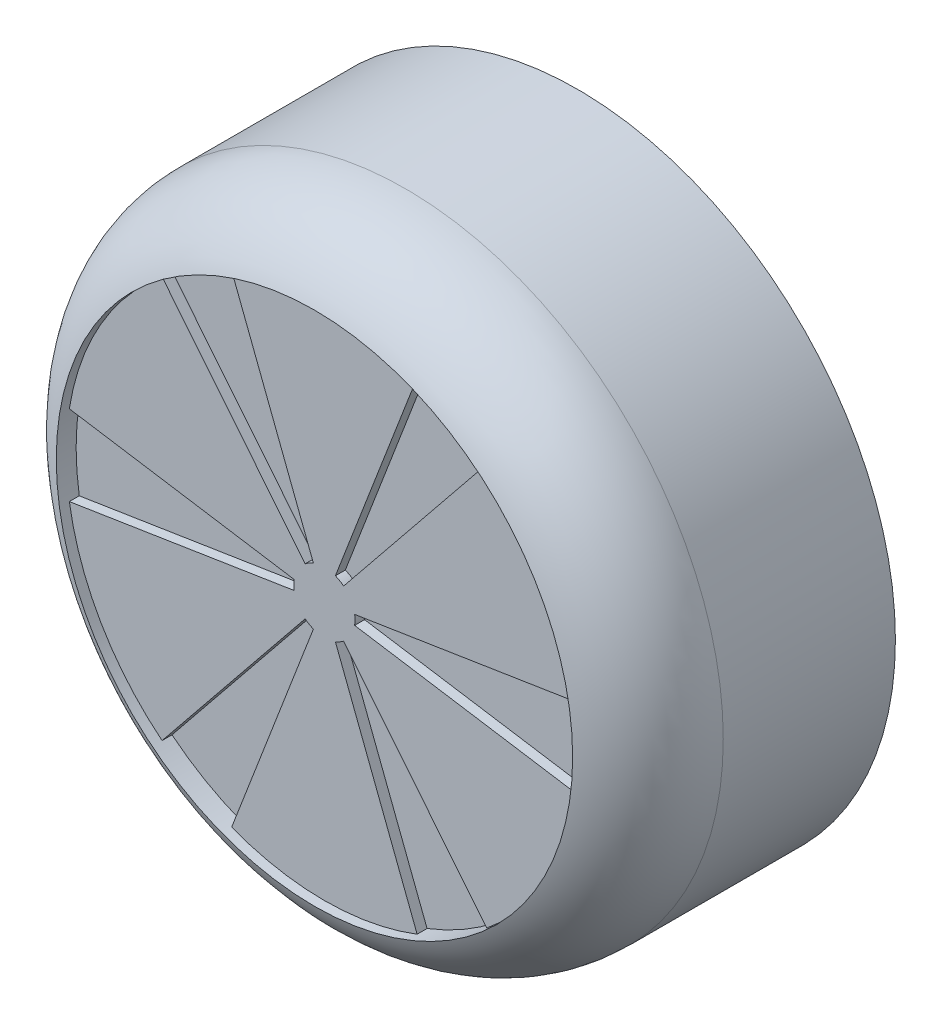
ISO-10303-21;
HEADER;
FILE_DESCRIPTION(('STEP AP214'),'2;1');
FILE_NAME('part.step','',(''),(''),'','','');
FILE_SCHEMA(('AUTOMOTIVE_DESIGN { 1 0 10303 214 1 1 1 1 }'));
ENDSEC;
DATA;
#1=APPLICATION_CONTEXT('core data for automotive mechanical design processes');
#2=APPLICATION_PROTOCOL_DEFINITION('international standard','automotive_design',2000,#1);
#3=PRODUCT_CONTEXT('',#1,'mechanical');
#4=PRODUCT('Part','Part','',(#3));
#5=PRODUCT_RELATED_PRODUCT_CATEGORY('part','',(#4));
#6=PRODUCT_DEFINITION_FORMATION('','',#4);
#7=PRODUCT_DEFINITION_CONTEXT('part definition',#1,'design');
#8=PRODUCT_DEFINITION('design','',#6,#7);
#9=PRODUCT_DEFINITION_SHAPE('','',#8);
#10=(LENGTH_UNIT() NAMED_UNIT(*) SI_UNIT(.MILLI.,.METRE.));
#11=(NAMED_UNIT(*) PLANE_ANGLE_UNIT() SI_UNIT($,.RADIAN.));
#12=(NAMED_UNIT(*) SI_UNIT($,.STERADIAN.) SOLID_ANGLE_UNIT());
#13=UNCERTAINTY_MEASURE_WITH_UNIT(LENGTH_MEASURE(1.E-05),#10,'distance_accuracy_value','');
#14=(GEOMETRIC_REPRESENTATION_CONTEXT(3) GLOBAL_UNCERTAINTY_ASSIGNED_CONTEXT((#13)) GLOBAL_UNIT_ASSIGNED_CONTEXT((#10,
#11,#12)) REPRESENTATION_CONTEXT('',''));
#15=CARTESIAN_POINT('',(0.,0.,0.));
#16=DIRECTION('',(0.,0.,1.));
#17=DIRECTION('',(1.,0.,0.));
#18=AXIS2_PLACEMENT_3D('',#15,#16,#17);
#19=CARTESIAN_POINT('',(0.,0.,24.5));
#20=DIRECTION('',(0.,0.,1.));
#21=DIRECTION('',(1.,0.,0.));
#22=AXIS2_PLACEMENT_3D('',#19,#20,#21);
#23=CYLINDRICAL_SURFACE('',#22,3.08302202342806);
#24=DIRECTION('',(0.,0.,1.));
#25=VECTOR('',#24,1.);
#26=CARTESIAN_POINT('',(-1.93816182168519,2.39761413699211,24.5));
#27=LINE('',#26,#25);
#28=CARTESIAN_POINT('',(-1.93816182168519,2.39761413699211,24.5));
#29=VERTEX_POINT('',#28);
#30=CARTESIAN_POINT('',(-1.93816182168519,2.39761413699211,25.5));
#31=VERTEX_POINT('',#30);
#32=EDGE_CURVE('E369',#29,#31,#27,.T.);
#33=ORIENTED_EDGE('',*,*,#32,.T.);
#34=CARTESIAN_POINT('',(0.,0.,25.5));
#35=DIRECTION('',(0.,0.,1.));
#36=DIRECTION('',(1.,0.,0.));
#37=AXIS2_PLACEMENT_3D('',#34,#35,#36);
#38=CIRCLE('',#37,3.08302202342806);
#39=CARTESIAN_POINT('',(-1.10731384026523,2.87730444272057,25.5));
#40=VERTEX_POINT('',#39);
#41=EDGE_CURVE('E434',#31,#40,#38,.F.);
#42=ORIENTED_EDGE('',*,*,#41,.T.);
#43=DIRECTION('',(0.,0.,1.));
#44=VECTOR('',#43,1.);
#45=CARTESIAN_POINT('',(-1.10731384026523,2.87730444272057,24.5));
#46=LINE('',#45,#44);
#47=CARTESIAN_POINT('',(-1.10731384026523,2.87730444272057,24.5));
#48=VERTEX_POINT('',#47);
#49=EDGE_CURVE('E366',#48,#40,#46,.T.);
#50=ORIENTED_EDGE('',*,*,#49,.F.);
#51=CARTESIAN_POINT('',(0.,0.,24.5));
#52=DIRECTION('',(0.,0.,1.));
#53=DIRECTION('',(1.,0.,0.));
#54=AXIS2_PLACEMENT_3D('',#51,#52,#53);
#55=CIRCLE('',#54,3.08302202342806);
#56=EDGE_CURVE('E155',#48,#29,#55,.T.);
#57=ORIENTED_EDGE('',*,*,#56,.T.);
#58=EDGE_LOOP('',(#33,#42,#50,#57));
#59=FACE_BOUND('',#58,.T.);
#60=ADVANCED_FACE('F132',(#59),#23,.T.);
#61=CARTESIAN_POINT('',(0.,0.,24.5));
#62=DIRECTION('',(-0.777683104036397,-0.628656495787894,0.));
#63=DIRECTION('',(0.628656495787894,-0.777683104036397,0.));
#64=AXIS2_PLACEMENT_3D('',#61,#62,#63);
#65=PLANE('',#64);
#66=DIRECTION('',(-0.628656495787894,0.777683104036397,0.));
#67=VECTOR('',#66,1.);
#68=CARTESIAN_POINT('',(0.,0.,25.5));
#69=LINE('',#68,#67);
#70=CARTESIAN_POINT('',(-16.3450688904852,20.2197607049463,25.5));
#71=VERTEX_POINT('',#70);
#72=EDGE_CURVE('E437',#31,#71,#69,.T.);
#73=ORIENTED_EDGE('',*,*,#72,.F.);
#74=ORIENTED_EDGE('',*,*,#32,.F.);
#75=DIRECTION('',(0.628656495787894,-0.777683104036397,0.));
#76=VECTOR('',#75,1.);
#77=CARTESIAN_POINT('',(0.,0.,24.5));
#78=LINE('',#77,#76);
#79=CARTESIAN_POINT('',(-16.3450688904852,20.2197607049463,24.5));
#80=VERTEX_POINT('',#79);
#81=EDGE_CURVE('E363',#80,#29,#78,.T.);
#82=ORIENTED_EDGE('',*,*,#81,.F.);
#83=DIRECTION('',(0.,0.,1.));
#84=VECTOR('',#83,1.);
#85=CARTESIAN_POINT('',(-16.3450688904852,20.2197607049463,24.5));
#86=LINE('',#85,#84);
#87=EDGE_CURVE('E372',#80,#71,#86,.T.);
#88=ORIENTED_EDGE('',*,*,#87,.T.);
#89=EDGE_LOOP('',(#73,#74,#82,#88));
#90=FACE_BOUND('',#89,.T.);
#91=ADVANCED_FACE('F511',(#90),#65,.F.);
#92=CARTESIAN_POINT('',(0.,0.,24.5));
#93=DIRECTION('',(0.933274047624626,0.359165076295494,0.));
#94=DIRECTION('',(-0.359165076295494,0.933274047624626,0.));
#95=AXIS2_PLACEMENT_3D('',#92,#93,#94);
#96=PLANE('',#95);
#97=DIRECTION('',(0.359165076295494,-0.933274047624626,0.));
#98=VECTOR('',#97,1.);
#99=CARTESIAN_POINT('',(0.,0.,25.5));
#100=LINE('',#99,#98);
#101=CARTESIAN_POINT('',(-9.33829198368283,24.2651252382403,25.5));
#102=VERTEX_POINT('',#101);
#103=EDGE_CURVE('E303',#102,#40,#100,.T.);
#104=ORIENTED_EDGE('',*,*,#103,.F.);
#105=DIRECTION('',(0.,0.,1.));
#106=VECTOR('',#105,1.);
#107=CARTESIAN_POINT('',(-9.33829198368283,24.2651252382403,24.5));
#108=LINE('',#107,#106);
#109=CARTESIAN_POINT('',(-9.33829198368283,24.2651252382403,24.5));
#110=VERTEX_POINT('',#109);
#111=EDGE_CURVE('E375',#110,#102,#108,.T.);
#112=ORIENTED_EDGE('',*,*,#111,.F.);
#113=DIRECTION('',(-0.359165076295494,0.933274047624626,0.));
#114=VECTOR('',#113,1.);
#115=CARTESIAN_POINT('',(0.,0.,24.5));
#116=LINE('',#115,#114);
#117=EDGE_CURVE('E357',#48,#110,#116,.T.);
#118=ORIENTED_EDGE('',*,*,#117,.F.);
#119=ORIENTED_EDGE('',*,*,#49,.T.);
#120=EDGE_LOOP('',(#104,#112,#118,#119));
#121=FACE_BOUND('',#120,.T.);
#122=ADVANCED_FACE('F516',(#121),#96,.F.);
#123=CARTESIAN_POINT('',(0.,0.,24.5));
#124=DIRECTION('',(0.,0.,1.));
#125=DIRECTION('',(1.,0.,0.));
#126=AXIS2_PLACEMENT_3D('',#123,#124,#125);
#127=CYLINDRICAL_SURFACE('',#126,3.08302202342806);
#128=DIRECTION('',(0.,0.,1.));
#129=VECTOR('',#128,1.);
#130=CARTESIAN_POINT('',(3.04547566195046,0.479690305728472,24.5));
#131=LINE('',#130,#129);
#132=CARTESIAN_POINT('',(3.04547566195046,0.479690305728472,24.5));
#133=VERTEX_POINT('',#132);
#134=CARTESIAN_POINT('',(3.04547566195046,0.479690305728471,25.5));
#135=VERTEX_POINT('',#134);
#136=EDGE_CURVE('E323',#133,#135,#131,.T.);
#137=ORIENTED_EDGE('',*,*,#136,.T.);
#138=CARTESIAN_POINT('',(0.,0.,25.5));
#139=DIRECTION('',(0.,0.,1.));
#140=DIRECTION('',(1.,0.,0.));
#141=AXIS2_PLACEMENT_3D('',#138,#139,#140);
#142=CIRCLE('',#141,3.08302202342806);
#143=CARTESIAN_POINT('',(3.04547566195046,-0.479690305728466,25.5));
#144=VERTEX_POINT('',#143);
#145=EDGE_CURVE('E298',#135,#144,#142,.F.);
#146=ORIENTED_EDGE('',*,*,#145,.T.);
#147=DIRECTION('',(0.,0.,1.));
#148=VECTOR('',#147,1.);
#149=CARTESIAN_POINT('',(3.04547566195046,-0.479690305728466,24.5));
#150=LINE('',#149,#148);
#151=CARTESIAN_POINT('',(3.04547566195046,-0.479690305728466,24.5));
#152=VERTEX_POINT('',#151);
#153=EDGE_CURVE('E329',#152,#144,#150,.T.);
#154=ORIENTED_EDGE('',*,*,#153,.F.);
#155=CARTESIAN_POINT('',(0.,0.,24.5));
#156=DIRECTION('',(0.,0.,1.));
#157=DIRECTION('',(1.,0.,0.));
#158=AXIS2_PLACEMENT_3D('',#155,#156,#157);
#159=CIRCLE('',#158,3.08302202342806);
#160=EDGE_CURVE('E409',#152,#133,#159,.T.);
#161=ORIENTED_EDGE('',*,*,#160,.T.);
#162=EDGE_LOOP('',(#137,#146,#154,#161));
#163=FACE_BOUND('',#162,.T.);
#164=ADVANCED_FACE('F567',(#163),#127,.T.);
#165=CARTESIAN_POINT('',(0.,0.,24.5));
#166=DIRECTION('',(-0.155590943588232,0.987821572083402,0.));
#167=DIRECTION('',(-0.987821572083402,-0.155590943588232,0.));
#168=AXIS2_PLACEMENT_3D('',#165,#166,#167);
#169=PLANE('',#168);
#170=DIRECTION('',(0.987821572083402,0.155590943588232,0.));
#171=VECTOR('',#170,1.);
#172=CARTESIAN_POINT('',(0.,0.,25.5));
#173=LINE('',#172,#171);
#174=CARTESIAN_POINT('',(25.6833608741685,4.04536453329403,25.5));
#175=VERTEX_POINT('',#174);
#176=EDGE_CURVE('E292',#135,#175,#173,.T.);
#177=ORIENTED_EDGE('',*,*,#176,.F.);
#178=ORIENTED_EDGE('',*,*,#136,.F.);
#179=DIRECTION('',(-0.987821572083402,-0.155590943588232,0.));
#180=VECTOR('',#179,1.);
#181=CARTESIAN_POINT('',(0.,0.,24.5));
#182=LINE('',#181,#180);
#183=CARTESIAN_POINT('',(25.6833608741685,4.04536453329403,24.5));
#184=VERTEX_POINT('',#183);
#185=EDGE_CURVE('E322',#184,#133,#182,.T.);
#186=ORIENTED_EDGE('',*,*,#185,.F.);
#187=DIRECTION('',(0.,0.,1.));
#188=VECTOR('',#187,1.);
#189=CARTESIAN_POINT('',(25.6833608741685,4.04536453329403,24.5));
#190=LINE('',#189,#188);
#191=EDGE_CURVE('E311',#184,#175,#190,.T.);
#192=ORIENTED_EDGE('',*,*,#191,.T.);
#193=EDGE_LOOP('',(#177,#178,#186,#192));
#194=FACE_BOUND('',#193,.T.);
#195=ADVANCED_FACE('F320',(#194),#169,.F.);
#196=CARTESIAN_POINT('',(0.,0.,24.5));
#197=DIRECTION('',(-0.15559094358823,-0.987821572083402,0.));
#198=DIRECTION('',(0.987821572083402,-0.15559094358823,0.));
#199=AXIS2_PLACEMENT_3D('',#196,#197,#198);
#200=PLANE('',#199);
#201=DIRECTION('',(-0.987821572083402,0.15559094358823,0.));
#202=VECTOR('',#201,1.);
#203=CARTESIAN_POINT('',(0.,0.,25.5));
#204=LINE('',#203,#202);
#205=CARTESIAN_POINT('',(25.6833608741685,-4.04536453329398,25.5));
#206=VERTEX_POINT('',#205);
#207=EDGE_CURVE('E425',#206,#144,#204,.T.);
#208=ORIENTED_EDGE('',*,*,#207,.F.);
#209=DIRECTION('',(0.,0.,1.));
#210=VECTOR('',#209,1.);
#211=CARTESIAN_POINT('',(25.6833608741685,-4.04536453329398,24.5));
#212=LINE('',#211,#210);
#213=CARTESIAN_POINT('',(25.6833608741685,-4.04536453329398,24.5));
#214=VERTEX_POINT('',#213);
#215=EDGE_CURVE('E324',#214,#206,#212,.T.);
#216=ORIENTED_EDGE('',*,*,#215,.F.);
#217=DIRECTION('',(0.987821572083402,-0.15559094358823,0.));
#218=VECTOR('',#217,1.);
#219=CARTESIAN_POINT('',(0.,0.,24.5));
#220=LINE('',#219,#218);
#221=EDGE_CURVE('E411',#152,#214,#220,.T.);
#222=ORIENTED_EDGE('',*,*,#221,.F.);
#223=ORIENTED_EDGE('',*,*,#153,.T.);
#224=EDGE_LOOP('',(#208,#216,#222,#223));
#225=FACE_BOUND('',#224,.T.);
#226=ADVANCED_FACE('F424',(#225),#200,.F.);
#227=CARTESIAN_POINT('',(0.,0.,24.5));
#228=DIRECTION('',(0.,0.,1.));
#229=DIRECTION('',(1.,0.,0.));
#230=AXIS2_PLACEMENT_3D('',#227,#228,#229);
#231=CYLINDRICAL_SURFACE('',#230,3.08302202342806);
#232=DIRECTION('',(0.,0.,1.));
#233=VECTOR('',#232,1.);
#234=CARTESIAN_POINT('',(1.10731384026528,2.87730444272055,24.5));
#235=LINE('',#234,#233);
#236=CARTESIAN_POINT('',(1.10731384026528,2.87730444272055,24.5));
#237=VERTEX_POINT('',#236);
#238=CARTESIAN_POINT('',(1.10731384026528,2.87730444272055,25.5));
#239=VERTEX_POINT('',#238);
#240=EDGE_CURVE('E346',#237,#239,#235,.T.);
#241=ORIENTED_EDGE('',*,*,#240,.T.);
#242=CARTESIAN_POINT('',(0.,0.,25.5));
#243=DIRECTION('',(0.,0.,1.));
#244=DIRECTION('',(1.,0.,0.));
#245=AXIS2_PLACEMENT_3D('',#242,#243,#244);
#246=CIRCLE('',#245,3.08302202342806);
#247=CARTESIAN_POINT('',(1.93816182168523,2.39761413699207,25.5));
#248=VERTEX_POINT('',#247);
#249=EDGE_CURVE('E429',#239,#248,#246,.F.);
#250=ORIENTED_EDGE('',*,*,#249,.T.);
#251=DIRECTION('',(0.,0.,1.));
#252=VECTOR('',#251,1.);
#253=CARTESIAN_POINT('',(1.93816182168523,2.39761413699207,24.5));
#254=LINE('',#253,#252);
#255=CARTESIAN_POINT('',(1.93816182168523,2.39761413699207,24.5));
#256=VERTEX_POINT('',#255);
#257=EDGE_CURVE('E345',#256,#248,#254,.T.);
#258=ORIENTED_EDGE('',*,*,#257,.F.);
#259=CARTESIAN_POINT('',(0.,0.,24.5));
#260=DIRECTION('',(0.,0.,1.));
#261=DIRECTION('',(1.,0.,0.));
#262=AXIS2_PLACEMENT_3D('',#259,#260,#261);
#263=CIRCLE('',#262,3.08302202342806);
#264=EDGE_CURVE('E326',#256,#237,#263,.T.);
#265=ORIENTED_EDGE('',*,*,#264,.T.);
#266=EDGE_LOOP('',(#241,#250,#258,#265));
#267=FACE_BOUND('',#266,.T.);
#268=ADVANCED_FACE('F550',(#267),#231,.T.);
#269=CARTESIAN_POINT('',(0.,0.,24.5));
#270=DIRECTION('',(-0.933274047624619,0.359165076295511,0.));
#271=DIRECTION('',(-0.359165076295511,-0.933274047624619,0.));
#272=AXIS2_PLACEMENT_3D('',#269,#270,#271);
#273=PLANE('',#272);
#274=DIRECTION('',(0.359165076295511,0.933274047624619,0.));
#275=VECTOR('',#274,1.);
#276=CARTESIAN_POINT('',(0.,0.,25.5));
#277=LINE('',#276,#275);
#278=CARTESIAN_POINT('',(9.3382919836833,24.2651252382401,25.5));
#279=VERTEX_POINT('',#278);
#280=EDGE_CURVE('E426',#239,#279,#277,.T.);
#281=ORIENTED_EDGE('',*,*,#280,.F.);
#282=ORIENTED_EDGE('',*,*,#240,.F.);
#283=DIRECTION('',(-0.359165076295511,-0.933274047624619,0.));
#284=VECTOR('',#283,1.);
#285=CARTESIAN_POINT('',(0.,0.,24.5));
#286=LINE('',#285,#284);
#287=CARTESIAN_POINT('',(9.3382919836833,24.2651252382401,24.5));
#288=VERTEX_POINT('',#287);
#289=EDGE_CURVE('E342',#288,#237,#286,.T.);
#290=ORIENTED_EDGE('',*,*,#289,.F.);
#291=DIRECTION('',(0.,0.,1.));
#292=VECTOR('',#291,1.);
#293=CARTESIAN_POINT('',(9.3382919836833,24.2651252382401,24.5));
#294=LINE('',#293,#292);
#295=EDGE_CURVE('E350',#288,#279,#294,.T.);
#296=ORIENTED_EDGE('',*,*,#295,.T.);
#297=EDGE_LOOP('',(#281,#282,#290,#296));
#298=FACE_BOUND('',#297,.T.);
#299=ADVANCED_FACE('F553',(#298),#273,.F.);
#300=CARTESIAN_POINT('',(0.,0.,24.5));
#301=DIRECTION('',(0.777683104036385,-0.628656495787909,0.));
#302=DIRECTION('',(0.628656495787909,0.777683104036385,0.));
#303=AXIS2_PLACEMENT_3D('',#300,#301,#302);
#304=PLANE('',#303);
#305=DIRECTION('',(-0.628656495787909,-0.777683104036385,0.));
#306=VECTOR('',#305,1.);
#307=CARTESIAN_POINT('',(0.,0.,25.5));
#308=LINE('',#307,#306);
#309=CARTESIAN_POINT('',(16.3450688904856,20.219760704946,25.5));
#310=VERTEX_POINT('',#309);
#311=EDGE_CURVE('E689',#310,#248,#308,.T.);
#312=ORIENTED_EDGE('',*,*,#311,.F.);
#313=DIRECTION('',(0.,0.,1.));
#314=VECTOR('',#313,1.);
#315=CARTESIAN_POINT('',(16.3450688904856,20.219760704946,24.5));
#316=LINE('',#315,#314);
#317=CARTESIAN_POINT('',(16.3450688904856,20.219760704946,24.5));
#318=VERTEX_POINT('',#317);
#319=EDGE_CURVE('E314',#318,#310,#316,.T.);
#320=ORIENTED_EDGE('',*,*,#319,.F.);
#321=DIRECTION('',(0.628656495787909,0.777683104036385,0.));
#322=VECTOR('',#321,1.);
#323=CARTESIAN_POINT('',(0.,0.,24.5));
#324=LINE('',#323,#322);
#325=EDGE_CURVE('E336',#256,#318,#324,.T.);
#326=ORIENTED_EDGE('',*,*,#325,.F.);
#327=ORIENTED_EDGE('',*,*,#257,.T.);
#328=EDGE_LOOP('',(#312,#320,#326,#327));
#329=FACE_BOUND('',#328,.T.);
#330=ADVANCED_FACE('F555',(#329),#304,.F.);
#331=CARTESIAN_POINT('',(0.,0.,24.5));
#332=DIRECTION('',(0.,0.,1.));
#333=DIRECTION('',(1.,0.,0.));
#334=AXIS2_PLACEMENT_3D('',#331,#332,#333);
#335=CYLINDRICAL_SURFACE('',#334,3.08302202342806);
#336=DIRECTION('',(0.,0.,1.));
#337=VECTOR('',#336,1.);
#338=CARTESIAN_POINT('',(1.9381618216852,-2.39761413699209,24.5));
#339=LINE('',#338,#337);
#340=CARTESIAN_POINT('',(1.9381618216852,-2.39761413699209,24.5));
#341=VERTEX_POINT('',#340);
#342=CARTESIAN_POINT('',(1.9381618216852,-2.39761413699209,25.5));
#343=VERTEX_POINT('',#342);
#344=EDGE_CURVE('E412',#341,#343,#339,.T.);
#345=ORIENTED_EDGE('',*,*,#344,.T.);
#346=CARTESIAN_POINT('',(0.,0.,25.5));
#347=DIRECTION('',(0.,0.,1.));
#348=DIRECTION('',(1.,0.,0.));
#349=AXIS2_PLACEMENT_3D('',#346,#347,#348);
#350=CIRCLE('',#349,3.08302202342806);
#351=CARTESIAN_POINT('',(1.10731384026525,-2.87730444272056,25.5));
#352=VERTEX_POINT('',#351);
#353=EDGE_CURVE('E684',#343,#352,#350,.F.);
#354=ORIENTED_EDGE('',*,*,#353,.T.);
#355=DIRECTION('',(0.,0.,1.));
#356=VECTOR('',#355,1.);
#357=CARTESIAN_POINT('',(1.10731384026525,-2.87730444272056,24.5));
#358=LINE('',#357,#356);
#359=CARTESIAN_POINT('',(1.10731384026525,-2.87730444272056,24.5));
#360=VERTEX_POINT('',#359);
#361=EDGE_CURVE('E451',#360,#352,#358,.T.);
#362=ORIENTED_EDGE('',*,*,#361,.F.);
#363=CARTESIAN_POINT('',(0.,0.,24.5));
#364=DIRECTION('',(0.,0.,1.));
#365=DIRECTION('',(1.,0.,0.));
#366=AXIS2_PLACEMENT_3D('',#363,#364,#365);
#367=CIRCLE('',#366,3.08302202342806);
#368=EDGE_CURVE('E440',#360,#341,#367,.T.);
#369=ORIENTED_EDGE('',*,*,#368,.T.);
#370=EDGE_LOOP('',(#345,#354,#362,#369));
#371=FACE_BOUND('',#370,.T.);
#372=ADVANCED_FACE('F558',(#371),#335,.T.);
#373=CARTESIAN_POINT('',(0.,0.,24.5));
#374=DIRECTION('',(0.777683104036393,0.6286564957879,0.));
#375=DIRECTION('',(-0.6286564957879,0.777683104036393,0.));
#376=AXIS2_PLACEMENT_3D('',#373,#374,#375);
#377=PLANE('',#376);
#378=DIRECTION('',(0.6286564957879,-0.777683104036393,0.));
#379=VECTOR('',#378,1.);
#380=CARTESIAN_POINT('',(0.,0.,25.5));
#381=LINE('',#380,#379);
#382=CARTESIAN_POINT('',(16.3450688904854,-20.2197607049462,25.5));
#383=VERTEX_POINT('',#382);
#384=EDGE_CURVE('E687',#343,#383,#381,.T.);
#385=ORIENTED_EDGE('',*,*,#384,.F.);
#386=ORIENTED_EDGE('',*,*,#344,.F.);
#387=DIRECTION('',(-0.6286564957879,0.777683104036393,0.));
#388=VECTOR('',#387,1.);
#389=CARTESIAN_POINT('',(0.,0.,24.5));
#390=LINE('',#389,#388);
#391=CARTESIAN_POINT('',(16.3450688904854,-20.2197607049462,24.5));
#392=VERTEX_POINT('',#391);
#393=EDGE_CURVE('E448',#392,#341,#390,.T.);
#394=ORIENTED_EDGE('',*,*,#393,.F.);
#395=DIRECTION('',(0.,0.,1.));
#396=VECTOR('',#395,1.);
#397=CARTESIAN_POINT('',(16.3450688904854,-20.2197607049462,24.5));
#398=LINE('',#397,#396);
#399=EDGE_CURVE('E454',#392,#383,#398,.T.);
#400=ORIENTED_EDGE('',*,*,#399,.T.);
#401=EDGE_LOOP('',(#385,#386,#394,#400));
#402=FACE_BOUND('',#401,.T.);
#403=ADVANCED_FACE('F642',(#402),#377,.F.);
#404=CARTESIAN_POINT('',(0.,0.,24.5));
#405=DIRECTION('',(-0.933274047624623,-0.3591650762955,0.));
#406=DIRECTION('',(0.3591650762955,-0.933274047624623,0.));
#407=AXIS2_PLACEMENT_3D('',#404,#405,#406);
#408=PLANE('',#407);
#409=DIRECTION('',(-0.3591650762955,0.933274047624623,0.));
#410=VECTOR('',#409,1.);
#411=CARTESIAN_POINT('',(0.,0.,25.5));
#412=LINE('',#411,#410);
#413=CARTESIAN_POINT('',(9.33829198368301,-24.2651252382402,25.5));
#414=VERTEX_POINT('',#413);
#415=EDGE_CURVE('E682',#414,#352,#412,.T.);
#416=ORIENTED_EDGE('',*,*,#415,.F.);
#417=DIRECTION('',(0.,0.,1.));
#418=VECTOR('',#417,1.);
#419=CARTESIAN_POINT('',(9.338291983683,-24.2651252382402,24.5));
#420=LINE('',#419,#418);
#421=CARTESIAN_POINT('',(9.338291983683,-24.2651252382402,24.5));
#422=VERTEX_POINT('',#421);
#423=EDGE_CURVE('E456',#422,#414,#420,.T.);
#424=ORIENTED_EDGE('',*,*,#423,.F.);
#425=DIRECTION('',(0.3591650762955,-0.933274047624623,0.));
#426=VECTOR('',#425,1.);
#427=CARTESIAN_POINT('',(0.,0.,24.5));
#428=LINE('',#427,#426);
#429=EDGE_CURVE('E442',#360,#422,#428,.T.);
#430=ORIENTED_EDGE('',*,*,#429,.F.);
#431=ORIENTED_EDGE('',*,*,#361,.T.);
#432=EDGE_LOOP('',(#416,#424,#430,#431));
#433=FACE_BOUND('',#432,.T.);
#434=ADVANCED_FACE('F645',(#433),#408,.F.);
#435=CARTESIAN_POINT('',(0.,0.,24.5));
#436=DIRECTION('',(0.,0.,1.));
#437=DIRECTION('',(1.,0.,0.));
#438=AXIS2_PLACEMENT_3D('',#435,#436,#437);
#439=CYLINDRICAL_SURFACE('',#438,3.08302202342806);
#440=DIRECTION('',(0.,0.,1.));
#441=VECTOR('',#440,1.);
#442=CARTESIAN_POINT('',(-3.04547566195046,-0.47969030572845,24.5));
#443=LINE('',#442,#441);
#444=CARTESIAN_POINT('',(-3.04547566195046,-0.47969030572845,24.5));
#445=VERTEX_POINT('',#444);
#446=CARTESIAN_POINT('',(-3.04547566195046,-0.47969030572845,25.5));
#447=VERTEX_POINT('',#446);
#448=EDGE_CURVE('E472',#445,#447,#443,.T.);
#449=ORIENTED_EDGE('',*,*,#448,.T.);
#450=CARTESIAN_POINT('',(0.,0.,25.5));
#451=DIRECTION('',(0.,0.,1.));
#452=DIRECTION('',(1.,0.,0.));
#453=AXIS2_PLACEMENT_3D('',#450,#451,#452);
#454=CIRCLE('',#453,3.08302202342806);
#455=CARTESIAN_POINT('',(-3.04547566195045,0.479690305728488,25.5));
#456=VERTEX_POINT('',#455);
#457=EDGE_CURVE('E665',#447,#456,#454,.F.);
#458=ORIENTED_EDGE('',*,*,#457,.T.);
#459=DIRECTION('',(0.,0.,1.));
#460=VECTOR('',#459,1.);
#461=CARTESIAN_POINT('',(-3.04547566195045,0.479690305728488,24.5));
#462=LINE('',#461,#460);
#463=CARTESIAN_POINT('',(-3.04547566195045,0.479690305728488,24.5));
#464=VERTEX_POINT('',#463);
#465=EDGE_CURVE('E471',#464,#456,#462,.T.);
#466=ORIENTED_EDGE('',*,*,#465,.F.);
#467=CARTESIAN_POINT('',(0.,0.,24.5));
#468=DIRECTION('',(0.,0.,1.));
#469=DIRECTION('',(1.,0.,0.));
#470=AXIS2_PLACEMENT_3D('',#467,#468,#469);
#471=CIRCLE('',#470,3.08302202342806);
#472=EDGE_CURVE('E439',#464,#445,#471,.T.);
#473=ORIENTED_EDGE('',*,*,#472,.T.);
#474=EDGE_LOOP('',(#449,#458,#466,#473));
#475=FACE_BOUND('',#474,.T.);
#476=ADVANCED_FACE('F649',(#475),#439,.T.);
#477=CARTESIAN_POINT('',(0.,0.,24.5));
#478=DIRECTION('',(0.155590943588225,-0.987821572083403,0.));
#479=DIRECTION('',(0.987821572083403,0.155590943588225,0.));
#480=AXIS2_PLACEMENT_3D('',#477,#478,#479);
#481=PLANE('',#480);
#482=DIRECTION('',(-0.987821572083403,-0.155590943588225,0.));
#483=VECTOR('',#482,1.);
#484=CARTESIAN_POINT('',(0.,0.,25.5));
#485=LINE('',#484,#483);
#486=CARTESIAN_POINT('',(-25.6833608741685,-4.04536453329385,25.5));
#487=VERTEX_POINT('',#486);
#488=EDGE_CURVE('E669',#447,#487,#485,.T.);
#489=ORIENTED_EDGE('',*,*,#488,.F.);
#490=ORIENTED_EDGE('',*,*,#448,.F.);
#491=DIRECTION('',(0.987821572083403,0.155590943588225,0.));
#492=VECTOR('',#491,1.);
#493=CARTESIAN_POINT('',(0.,0.,24.5));
#494=LINE('',#493,#492);
#495=CARTESIAN_POINT('',(-25.6833608741685,-4.04536453329385,24.5));
#496=VERTEX_POINT('',#495);
#497=EDGE_CURVE('E468',#496,#445,#494,.T.);
#498=ORIENTED_EDGE('',*,*,#497,.F.);
#499=DIRECTION('',(0.,0.,1.));
#500=VECTOR('',#499,1.);
#501=CARTESIAN_POINT('',(-25.6833608741685,-4.04536453329385,24.5));
#502=LINE('',#501,#500);
#503=EDGE_CURVE('E476',#496,#487,#502,.T.);
#504=ORIENTED_EDGE('',*,*,#503,.T.);
#505=EDGE_LOOP('',(#489,#490,#498,#504));
#506=FACE_BOUND('',#505,.T.);
#507=ADVANCED_FACE('F654',(#506),#481,.F.);
#508=CARTESIAN_POINT('',(0.,0.,24.5));
#509=DIRECTION('',(0.155590943588237,0.987821572083401,0.));
#510=DIRECTION('',(-0.987821572083401,0.155590943588237,0.));
#511=AXIS2_PLACEMENT_3D('',#508,#509,#510);
#512=PLANE('',#511);
#513=DIRECTION('',(0.987821572083401,-0.155590943588237,0.));
#514=VECTOR('',#513,1.);
#515=CARTESIAN_POINT('',(0.,0.,25.5));
#516=LINE('',#515,#514);
#517=CARTESIAN_POINT('',(-25.6833608741684,4.04536453329416,25.5));
#518=VERTEX_POINT('',#517);
#519=EDGE_CURVE('E678',#518,#456,#516,.T.);
#520=ORIENTED_EDGE('',*,*,#519,.F.);
#521=DIRECTION('',(0.,0.,1.));
#522=VECTOR('',#521,1.);
#523=CARTESIAN_POINT('',(-25.6833608741684,4.04536453329416,24.5));
#524=LINE('',#523,#522);
#525=CARTESIAN_POINT('',(-25.6833608741684,4.04536453329416,24.5));
#526=VERTEX_POINT('',#525);
#527=EDGE_CURVE('E479',#526,#518,#524,.T.);
#528=ORIENTED_EDGE('',*,*,#527,.F.);
#529=DIRECTION('',(-0.987821572083401,0.155590943588237,0.));
#530=VECTOR('',#529,1.);
#531=CARTESIAN_POINT('',(0.,0.,24.5));
#532=LINE('',#531,#530);
#533=EDGE_CURVE('E462',#464,#526,#532,.T.);
#534=ORIENTED_EDGE('',*,*,#533,.F.);
#535=ORIENTED_EDGE('',*,*,#465,.T.);
#536=EDGE_LOOP('',(#520,#528,#534,#535));
#537=FACE_BOUND('',#536,.T.);
#538=ADVANCED_FACE('F578',(#537),#512,.F.);
#539=CARTESIAN_POINT('',(0.,0.,24.5));
#540=DIRECTION('',(0.,0.,1.));
#541=DIRECTION('',(1.,0.,0.));
#542=AXIS2_PLACEMENT_3D('',#539,#540,#541);
#543=CYLINDRICAL_SURFACE('',#542,3.08302202342806);
#544=DIRECTION('',(0.,0.,1.));
#545=VECTOR('',#544,1.);
#546=CARTESIAN_POINT('',(-1.10731384026526,-2.87730444272055,24.5));
#547=LINE('',#546,#545);
#548=CARTESIAN_POINT('',(-1.10731384026526,-2.87730444272055,24.5));
#549=VERTEX_POINT('',#548);
#550=CARTESIAN_POINT('',(-1.10731384026526,-2.87730444272055,25.5));
#551=VERTEX_POINT('',#550);
#552=EDGE_CURVE('E392',#549,#551,#547,.T.);
#553=ORIENTED_EDGE('',*,*,#552,.T.);
#554=CARTESIAN_POINT('',(0.,0.,25.5));
#555=DIRECTION('',(0.,0.,1.));
#556=DIRECTION('',(1.,0.,0.));
#557=AXIS2_PLACEMENT_3D('',#554,#555,#556);
#558=CIRCLE('',#557,3.08302202342806);
#559=CARTESIAN_POINT('',(-1.93816182168521,-2.39761413699208,25.5));
#560=VERTEX_POINT('',#559);
#561=EDGE_CURVE('E315',#551,#560,#558,.F.);
#562=ORIENTED_EDGE('',*,*,#561,.T.);
#563=DIRECTION('',(0.,0.,1.));
#564=VECTOR('',#563,1.);
#565=CARTESIAN_POINT('',(-1.93816182168522,-2.39761413699208,24.5));
#566=LINE('',#565,#564);
#567=CARTESIAN_POINT('',(-1.93816182168522,-2.39761413699208,24.5));
#568=VERTEX_POINT('',#567);
#569=EDGE_CURVE('E389',#568,#560,#566,.T.);
#570=ORIENTED_EDGE('',*,*,#569,.F.);
#571=CARTESIAN_POINT('',(0.,0.,24.5));
#572=DIRECTION('',(0.,0.,1.));
#573=DIRECTION('',(1.,0.,0.));
#574=AXIS2_PLACEMENT_3D('',#571,#572,#573);
#575=CIRCLE('',#574,3.08302202342806);
#576=EDGE_CURVE('E475',#568,#549,#575,.T.);
#577=ORIENTED_EDGE('',*,*,#576,.T.);
#578=EDGE_LOOP('',(#553,#562,#570,#577));
#579=FACE_BOUND('',#578,.T.);
#580=ADVANCED_FACE('F388',(#579),#543,.T.);
#581=CARTESIAN_POINT('',(0.,0.,24.5));
#582=DIRECTION('',(0.933274047624621,-0.359165076295505,0.));
#583=DIRECTION('',(0.359165076295505,0.933274047624621,0.));
#584=AXIS2_PLACEMENT_3D('',#581,#582,#583);
#585=PLANE('',#584);
#586=DIRECTION('',(-0.359165076295505,-0.933274047624621,0.));
#587=VECTOR('',#586,1.);
#588=CARTESIAN_POINT('',(0.,0.,25.5));
#589=LINE('',#588,#587);
#590=CARTESIAN_POINT('',(-9.33829198368313,-24.2651252382401,25.5));
#591=VERTEX_POINT('',#590);
#592=EDGE_CURVE('E393',#551,#591,#589,.T.);
#593=ORIENTED_EDGE('',*,*,#592,.F.);
#594=ORIENTED_EDGE('',*,*,#552,.F.);
#595=DIRECTION('',(0.359165076295505,0.933274047624621,0.));
#596=VECTOR('',#595,1.);
#597=CARTESIAN_POINT('',(0.,0.,24.5));
#598=LINE('',#597,#596);
#599=CARTESIAN_POINT('',(-9.33829198368314,-24.2651252382402,24.5));
#600=VERTEX_POINT('',#599);
#601=EDGE_CURVE('E400',#600,#549,#598,.T.);
#602=ORIENTED_EDGE('',*,*,#601,.F.);
#603=DIRECTION('',(0.,0.,1.));
#604=VECTOR('',#603,1.);
#605=CARTESIAN_POINT('',(-9.33829198368314,-24.2651252382402,24.5));
#606=LINE('',#605,#604);
#607=EDGE_CURVE('E402',#600,#591,#606,.T.);
#608=ORIENTED_EDGE('',*,*,#607,.T.);
#609=EDGE_LOOP('',(#593,#594,#602,#608));
#610=FACE_BOUND('',#609,.T.);
#611=ADVANCED_FACE('F491',(#610),#585,.F.);
#612=CARTESIAN_POINT('',(0.,0.,24.5));
#613=DIRECTION('',(-0.777683104036389,0.628656495787904,0.));
#614=DIRECTION('',(-0.628656495787904,-0.777683104036389,0.));
#615=AXIS2_PLACEMENT_3D('',#612,#613,#614);
#616=PLANE('',#615);
#617=DIRECTION('',(0.628656495787904,0.777683104036389,0.));
#618=VECTOR('',#617,1.);
#619=CARTESIAN_POINT('',(0.,0.,25.5));
#620=LINE('',#619,#618);
#621=CARTESIAN_POINT('',(-16.3450688904855,-20.2197607049461,25.5));
#622=VERTEX_POINT('',#621);
#623=EDGE_CURVE('E140',#622,#560,#620,.T.);
#624=ORIENTED_EDGE('',*,*,#623,.F.);
#625=DIRECTION('',(0.,0.,1.));
#626=VECTOR('',#625,1.);
#627=CARTESIAN_POINT('',(-16.3450688904855,-20.2197607049461,24.5));
#628=LINE('',#627,#626);
#629=CARTESIAN_POINT('',(-16.3450688904855,-20.2197607049461,24.5));
#630=VERTEX_POINT('',#629);
#631=EDGE_CURVE('E399',#630,#622,#628,.T.);
#632=ORIENTED_EDGE('',*,*,#631,.F.);
#633=DIRECTION('',(-0.628656495787904,-0.777683104036389,0.));
#634=VECTOR('',#633,1.);
#635=CARTESIAN_POINT('',(0.,0.,24.5));
#636=LINE('',#635,#634);
#637=EDGE_CURVE('E398',#568,#630,#636,.T.);
#638=ORIENTED_EDGE('',*,*,#637,.F.);
#639=ORIENTED_EDGE('',*,*,#569,.T.);
#640=EDGE_LOOP('',(#624,#632,#638,#639));
#641=FACE_BOUND('',#640,.T.);
#642=ADVANCED_FACE('F396',(#641),#616,.F.);
#643=CARTESIAN_POINT('',(0.,0.,26.5));
#644=DIRECTION('',(0.,0.,-1.));
#645=DIRECTION('',(-1.,0.,0.));
#646=AXIS2_PLACEMENT_3D('',#643,#644,#645);
#647=CYLINDRICAL_SURFACE('',#646,32.);
#648=CARTESIAN_POINT('',(0.,0.,17.3348486100883));
#649=DIRECTION('',(0.,0.,1.));
#650=DIRECTION('',(1.,0.,0.));
#651=AXIS2_PLACEMENT_3D('',#648,#649,#650);
#652=CIRCLE('',#651,32.);
#653=CARTESIAN_POINT('',(32.,0.,17.3348486100883));
#654=VERTEX_POINT('',#653);
#655=EDGE_CURVE('E12',#654,#654,#652,.F.);
#656=ORIENTED_EDGE('',*,*,#655,.T.);
#657=EDGE_LOOP('',(#656));
#658=FACE_BOUND('',#657,.T.);
#659=CARTESIAN_POINT('',(0.,0.,0.));
#660=DIRECTION('',(0.,0.,1.));
#661=DIRECTION('',(1.,0.,0.));
#662=AXIS2_PLACEMENT_3D('',#659,#660,#661);
#663=CIRCLE('',#662,32.);
#664=CARTESIAN_POINT('',(32.,0.,0.));
#665=VERTEX_POINT('',#664);
#666=EDGE_CURVE('E371',#665,#665,#663,.T.);
#667=ORIENTED_EDGE('',*,*,#666,.T.);
#668=EDGE_LOOP('',(#667));
#669=FACE_BOUND('',#668,.T.);
#670=ADVANCED_FACE('F524',(#658,#669),#647,.T.);
#671=CARTESIAN_POINT('',(0.,0.,0.));
#672=DIRECTION('',(0.,0.,1.));
#673=DIRECTION('',(1.,0.,0.));
#674=AXIS2_PLACEMENT_3D('',#671,#672,#673);
#675=PLANE('',#674);
#676=CARTESIAN_POINT('',(0.,0.,0.));
#677=DIRECTION('',(0.,0.,-1.));
#678=DIRECTION('',(-1.,0.,0.));
#679=AXIS2_PLACEMENT_3D('',#676,#677,#678);
#680=CIRCLE('',#679,6.6886358096008);
#681=CARTESIAN_POINT('',(-6.6886358096008,0.,0.));
#682=VERTEX_POINT('',#681);
#683=EDGE_CURVE('E674',#682,#682,#680,.T.);
#684=ORIENTED_EDGE('',*,*,#683,.F.);
#685=EDGE_LOOP('',(#684));
#686=FACE_BOUND('',#685,.T.);
#687=ORIENTED_EDGE('',*,*,#666,.F.);
#688=EDGE_LOOP('',(#687));
#689=FACE_BOUND('',#688,.T.);
#690=ADVANCED_FACE('F522',(#686,#689),#675,.F.);
#691=CARTESIAN_POINT('',(0.,0.,24.5));
#692=DIRECTION('',(0.,0.,1.));
#693=DIRECTION('',(1.,0.,0.));
#694=AXIS2_PLACEMENT_3D('',#691,#692,#693);
#695=CYLINDRICAL_SURFACE('',#694,26.);
#696=CARTESIAN_POINT('',(0.,0.,25.5));
#697=DIRECTION('',(0.,0.,1.));
#698=DIRECTION('',(1.,0.,0.));
#699=AXIS2_PLACEMENT_3D('',#696,#697,#698);
#700=CIRCLE('',#699,26.);
#701=EDGE_CURVE('E672',#71,#518,#700,.T.);
#702=ORIENTED_EDGE('',*,*,#701,.F.);
#703=ORIENTED_EDGE('',*,*,#87,.F.);
#704=CARTESIAN_POINT('',(0.,0.,24.5));
#705=DIRECTION('',(0.,0.,1.));
#706=DIRECTION('',(1.,0.,0.));
#707=AXIS2_PLACEMENT_3D('',#704,#705,#706);
#708=CIRCLE('',#707,26.);
#709=EDGE_CURVE('E360',#110,#80,#708,.T.);
#710=ORIENTED_EDGE('',*,*,#709,.F.);
#711=ORIENTED_EDGE('',*,*,#111,.T.);
#712=EDGE_CURVE('E316',#279,#102,#700,.T.);
#713=ORIENTED_EDGE('',*,*,#712,.F.);
#714=ORIENTED_EDGE('',*,*,#295,.F.);
#715=CARTESIAN_POINT('',(0.,0.,24.5));
#716=DIRECTION('',(0.,0.,1.));
#717=DIRECTION('',(1.,0.,0.));
#718=AXIS2_PLACEMENT_3D('',#715,#716,#717);
#719=CIRCLE('',#718,26.);
#720=EDGE_CURVE('E339',#318,#288,#719,.T.);
#721=ORIENTED_EDGE('',*,*,#720,.F.);
#722=ORIENTED_EDGE('',*,*,#319,.T.);
#723=EDGE_CURVE('E295',#175,#310,#700,.T.);
#724=ORIENTED_EDGE('',*,*,#723,.F.);
#725=ORIENTED_EDGE('',*,*,#191,.F.);
#726=CARTESIAN_POINT('',(0.,0.,24.5));
#727=DIRECTION('',(0.,0.,1.));
#728=DIRECTION('',(1.,0.,0.));
#729=AXIS2_PLACEMENT_3D('',#726,#727,#728);
#730=CIRCLE('',#729,26.);
#731=EDGE_CURVE('E415',#214,#184,#730,.T.);
#732=ORIENTED_EDGE('',*,*,#731,.F.);
#733=ORIENTED_EDGE('',*,*,#215,.T.);
#734=EDGE_CURVE('E318',#383,#206,#700,.T.);
#735=ORIENTED_EDGE('',*,*,#734,.F.);
#736=ORIENTED_EDGE('',*,*,#399,.F.);
#737=CARTESIAN_POINT('',(0.,0.,24.5));
#738=DIRECTION('',(0.,0.,1.));
#739=DIRECTION('',(1.,0.,0.));
#740=AXIS2_PLACEMENT_3D('',#737,#738,#739);
#741=CIRCLE('',#740,26.);
#742=EDGE_CURVE('E445',#422,#392,#741,.T.);
#743=ORIENTED_EDGE('',*,*,#742,.F.);
#744=ORIENTED_EDGE('',*,*,#423,.T.);
#745=EDGE_CURVE('E494',#591,#414,#700,.T.);
#746=ORIENTED_EDGE('',*,*,#745,.F.);
#747=ORIENTED_EDGE('',*,*,#607,.F.);
#748=CARTESIAN_POINT('',(0.,0.,24.5));
#749=DIRECTION('',(0.,0.,1.));
#750=DIRECTION('',(1.,0.,0.));
#751=AXIS2_PLACEMENT_3D('',#748,#749,#750);
#752=CIRCLE('',#751,26.);
#753=EDGE_CURVE('E405',#630,#600,#752,.T.);
#754=ORIENTED_EDGE('',*,*,#753,.F.);
#755=ORIENTED_EDGE('',*,*,#631,.T.);
#756=EDGE_CURVE('E147',#487,#622,#700,.T.);
#757=ORIENTED_EDGE('',*,*,#756,.F.);
#758=ORIENTED_EDGE('',*,*,#503,.F.);
#759=CARTESIAN_POINT('',(0.,0.,24.5));
#760=DIRECTION('',(0.,0.,1.));
#761=DIRECTION('',(1.,0.,0.));
#762=AXIS2_PLACEMENT_3D('',#759,#760,#761);
#763=CIRCLE('',#762,26.);
#764=EDGE_CURVE('E465',#526,#496,#763,.T.);
#765=ORIENTED_EDGE('',*,*,#764,.F.);
#766=ORIENTED_EDGE('',*,*,#527,.T.);
#767=EDGE_LOOP('',(#702,#703,#710,#711,#713,#714,#721,#722,#724,#725,#732,#733,#735,#736,#743,
#744,#746,#747,#754,#755,#757,#758,#765,#766));
#768=FACE_BOUND('',#767,.T.);
#769=CARTESIAN_POINT('',(0.,0.,26.5));
#770=DIRECTION('',(0.,0.,1.));
#771=DIRECTION('',(1.,0.,0.));
#772=AXIS2_PLACEMENT_3D('',#769,#770,#771);
#773=CIRCLE('',#772,26.);
#774=CARTESIAN_POINT('',(26.,0.,26.5));
#775=VERTEX_POINT('',#774);
#776=EDGE_CURVE('E349',#775,#775,#773,.T.);
#777=ORIENTED_EDGE('',*,*,#776,.T.);
#778=EDGE_LOOP('',(#777));
#779=FACE_BOUND('',#778,.T.);
#780=ADVANCED_FACE('F308',(#768,#779),#695,.F.);
#781=CARTESIAN_POINT('',(0.,0.,24.5));
#782=DIRECTION('',(0.,0.,1.));
#783=DIRECTION('',(1.,0.,0.));
#784=AXIS2_PLACEMENT_3D('',#781,#782,#783);
#785=PLANE('',#784);
#786=ORIENTED_EDGE('',*,*,#56,.F.);
#787=ORIENTED_EDGE('',*,*,#117,.T.);
#788=ORIENTED_EDGE('',*,*,#709,.T.);
#789=ORIENTED_EDGE('',*,*,#81,.T.);
#790=EDGE_LOOP('',(#786,#787,#788,#789));
#791=FACE_BOUND('',#790,.T.);
#792=ADVANCED_FACE('F543',(#791),#785,.T.);
#793=CARTESIAN_POINT('',(0.,0.,24.5));
#794=DIRECTION('',(0.,0.,1.));
#795=DIRECTION('',(1.,0.,0.));
#796=AXIS2_PLACEMENT_3D('',#793,#794,#795);
#797=PLANE('',#796);
#798=ORIENTED_EDGE('',*,*,#160,.F.);
#799=ORIENTED_EDGE('',*,*,#221,.T.);
#800=ORIENTED_EDGE('',*,*,#731,.T.);
#801=ORIENTED_EDGE('',*,*,#185,.T.);
#802=EDGE_LOOP('',(#798,#799,#800,#801));
#803=FACE_BOUND('',#802,.T.);
#804=ADVANCED_FACE('F418',(#803),#797,.T.);
#805=CARTESIAN_POINT('',(0.,0.,24.5));
#806=DIRECTION('',(0.,0.,1.));
#807=DIRECTION('',(1.,0.,0.));
#808=AXIS2_PLACEMENT_3D('',#805,#806,#807);
#809=PLANE('',#808);
#810=ORIENTED_EDGE('',*,*,#264,.F.);
#811=ORIENTED_EDGE('',*,*,#325,.T.);
#812=ORIENTED_EDGE('',*,*,#720,.T.);
#813=ORIENTED_EDGE('',*,*,#289,.T.);
#814=EDGE_LOOP('',(#810,#811,#812,#813));
#815=FACE_BOUND('',#814,.T.);
#816=ADVANCED_FACE('F563',(#815),#809,.T.);
#817=CARTESIAN_POINT('',(0.,0.,24.5));
#818=DIRECTION('',(0.,0.,1.));
#819=DIRECTION('',(1.,0.,0.));
#820=AXIS2_PLACEMENT_3D('',#817,#818,#819);
#821=PLANE('',#820);
#822=ORIENTED_EDGE('',*,*,#368,.F.);
#823=ORIENTED_EDGE('',*,*,#429,.T.);
#824=ORIENTED_EDGE('',*,*,#742,.T.);
#825=ORIENTED_EDGE('',*,*,#393,.T.);
#826=EDGE_LOOP('',(#822,#823,#824,#825));
#827=FACE_BOUND('',#826,.T.);
#828=ADVANCED_FACE('F505',(#827),#821,.T.);
#829=CARTESIAN_POINT('',(0.,0.,24.5));
#830=DIRECTION('',(0.,0.,1.));
#831=DIRECTION('',(1.,0.,0.));
#832=AXIS2_PLACEMENT_3D('',#829,#830,#831);
#833=PLANE('',#832);
#834=ORIENTED_EDGE('',*,*,#472,.F.);
#835=ORIENTED_EDGE('',*,*,#533,.T.);
#836=ORIENTED_EDGE('',*,*,#764,.T.);
#837=ORIENTED_EDGE('',*,*,#497,.T.);
#838=EDGE_LOOP('',(#834,#835,#836,#837));
#839=FACE_BOUND('',#838,.T.);
#840=ADVANCED_FACE('F498',(#839),#833,.T.);
#841=CARTESIAN_POINT('',(0.,0.,24.5));
#842=DIRECTION('',(0.,0.,1.));
#843=DIRECTION('',(1.,0.,0.));
#844=AXIS2_PLACEMENT_3D('',#841,#842,#843);
#845=PLANE('',#844);
#846=ORIENTED_EDGE('',*,*,#576,.F.);
#847=ORIENTED_EDGE('',*,*,#637,.T.);
#848=ORIENTED_EDGE('',*,*,#753,.T.);
#849=ORIENTED_EDGE('',*,*,#601,.T.);
#850=EDGE_LOOP('',(#846,#847,#848,#849));
#851=FACE_BOUND('',#850,.T.);
#852=ADVANCED_FACE('F496',(#851),#845,.T.);
#853=CARTESIAN_POINT('',(0.,0.,25.5));
#854=DIRECTION('',(0.,0.,1.));
#855=DIRECTION('',(1.,0.,0.));
#856=AXIS2_PLACEMENT_3D('',#853,#854,#855);
#857=PLANE('',#856);
#858=ORIENTED_EDGE('',*,*,#72,.T.);
#859=ORIENTED_EDGE('',*,*,#701,.T.);
#860=ORIENTED_EDGE('',*,*,#519,.T.);
#861=ORIENTED_EDGE('',*,*,#457,.F.);
#862=ORIENTED_EDGE('',*,*,#488,.T.);
#863=ORIENTED_EDGE('',*,*,#756,.T.);
#864=ORIENTED_EDGE('',*,*,#623,.T.);
#865=ORIENTED_EDGE('',*,*,#561,.F.);
#866=ORIENTED_EDGE('',*,*,#592,.T.);
#867=ORIENTED_EDGE('',*,*,#745,.T.);
#868=ORIENTED_EDGE('',*,*,#415,.T.);
#869=ORIENTED_EDGE('',*,*,#353,.F.);
#870=ORIENTED_EDGE('',*,*,#384,.T.);
#871=ORIENTED_EDGE('',*,*,#734,.T.);
#872=ORIENTED_EDGE('',*,*,#207,.T.);
#873=ORIENTED_EDGE('',*,*,#145,.F.);
#874=ORIENTED_EDGE('',*,*,#176,.T.);
#875=ORIENTED_EDGE('',*,*,#723,.T.);
#876=ORIENTED_EDGE('',*,*,#311,.T.);
#877=ORIENTED_EDGE('',*,*,#249,.F.);
#878=ORIENTED_EDGE('',*,*,#280,.T.);
#879=ORIENTED_EDGE('',*,*,#712,.T.);
#880=ORIENTED_EDGE('',*,*,#103,.T.);
#881=ORIENTED_EDGE('',*,*,#41,.F.);
#882=EDGE_LOOP('',(#858,#859,#860,#861,#862,#863,#864,#865,#866,#867,#868,#869,#870,#871,#872,
#873,#874,#875,#876,#877,#878,#879,#880,#881));
#883=FACE_BOUND('',#882,.T.);
#884=ADVANCED_FACE('F294',(#883),#857,.T.);
#885=CARTESIAN_POINT('',(0.,0.,17.3348486100883));
#886=DIRECTION('',(0.,0.,1.));
#887=DIRECTION('',(1.,0.,0.));
#888=AXIS2_PLACEMENT_3D('',#885,#886,#887);
#889=TOROIDAL_SURFACE('',#888,22.,10.);
#890=ORIENTED_EDGE('',*,*,#655,.F.);
#891=EDGE_LOOP('',(#890));
#892=FACE_BOUND('',#891,.T.);
#893=ORIENTED_EDGE('',*,*,#776,.F.);
#894=EDGE_LOOP('',(#893));
#895=FACE_BOUND('',#894,.T.);
#896=ADVANCED_FACE('F134',(#892,#895),#889,.T.);
#897=CARTESIAN_POINT('',(0.,0.,5.));
#898=DIRECTION('',(0.,0.,-1.));
#899=DIRECTION('',(-1.,0.,0.));
#900=AXIS2_PLACEMENT_3D('',#897,#898,#899);
#901=CYLINDRICAL_SURFACE('',#900,6.6886358096008);
#902=CARTESIAN_POINT('',(0.,0.,5.));
#903=DIRECTION('',(0.,0.,-1.));
#904=DIRECTION('',(-1.,0.,0.));
#905=AXIS2_PLACEMENT_3D('',#902,#903,#904);
#906=CIRCLE('',#905,6.6886358096008);
#907=CARTESIAN_POINT('',(-6.6886358096008,0.,5.));
#908=VERTEX_POINT('',#907);
#909=EDGE_CURVE('E859',#908,#908,#906,.T.);
#910=ORIENTED_EDGE('',*,*,#909,.F.);
#911=EDGE_LOOP('',(#910));
#912=FACE_BOUND('',#911,.T.);
#913=ORIENTED_EDGE('',*,*,#683,.T.);
#914=EDGE_LOOP('',(#913));
#915=FACE_BOUND('',#914,.T.);
#916=ADVANCED_FACE('F540',(#912,#915),#901,.F.);
#917=CARTESIAN_POINT('',(0.,0.,5.));
#918=DIRECTION('',(0.,0.,-1.));
#919=DIRECTION('',(-1.,0.,0.));
#920=AXIS2_PLACEMENT_3D('',#917,#918,#919);
#921=PLANE('',#920);
#922=ORIENTED_EDGE('',*,*,#909,.T.);
#923=EDGE_LOOP('',(#922));
#924=FACE_BOUND('',#923,.T.);
#925=ADVANCED_FACE('F623',(#924),#921,.T.);
#926=CLOSED_SHELL('',(#60,#91,#122,#164,#195,#226,#268,#299,#330,#372,#403,#434,#476,#507,#538,
#580,#611,#642,#670,#690,#780,#792,#804,#816,#828,#840,#852,#884,#896,#916,#925));
#927=MANIFOLD_SOLID_BREP('B2',#926);
#928=ADVANCED_BREP_SHAPE_REPRESENTATION('',(#18,#927),#14);
#929=SHAPE_DEFINITION_REPRESENTATION(#9,#928);
ENDSEC;
END-ISO-10303-21;
